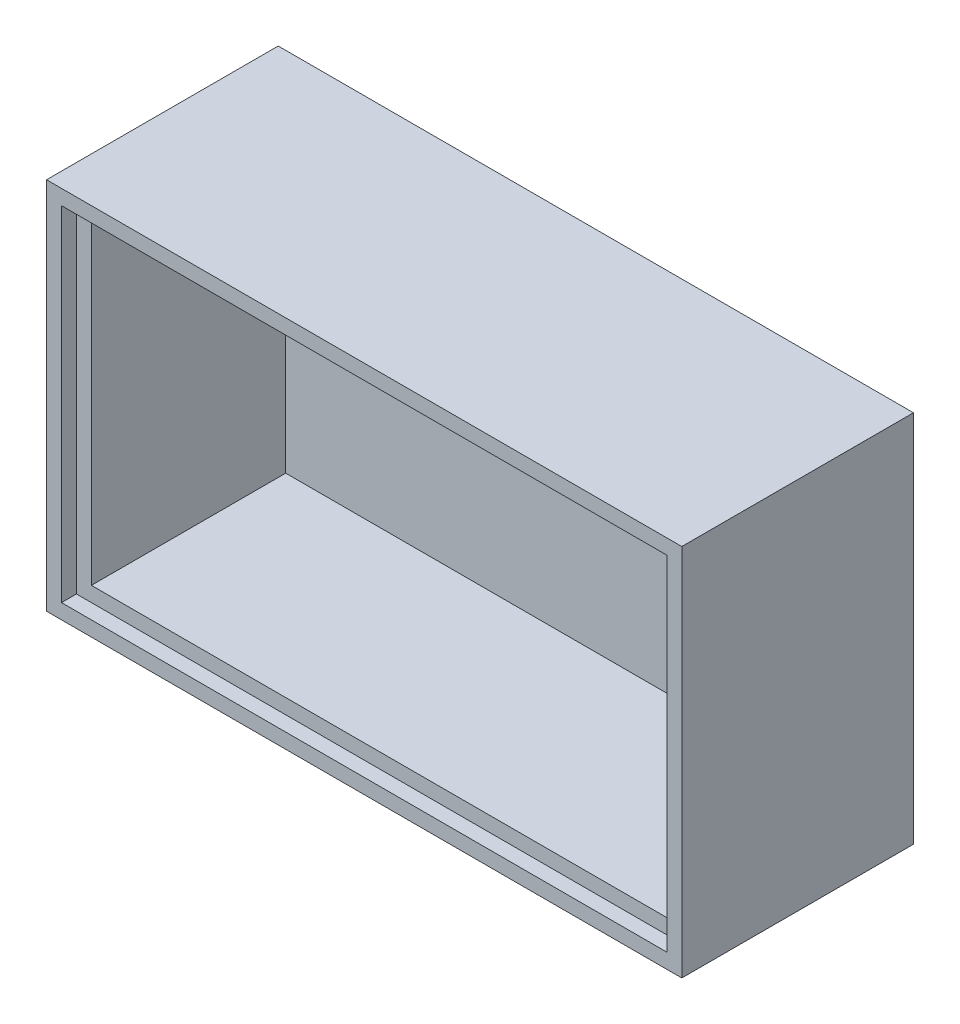
ISO-10303-21;
HEADER;
FILE_DESCRIPTION(('STEP AP214'),'2;1');
FILE_NAME('part.step','',(''),(''),'','','');
FILE_SCHEMA(('AUTOMOTIVE_DESIGN { 1 0 10303 214 1 1 1 1 }'));
ENDSEC;
DATA;
#1=APPLICATION_CONTEXT('core data for automotive mechanical design processes');
#2=APPLICATION_PROTOCOL_DEFINITION('international standard','automotive_design',2000,#1);
#3=PRODUCT_CONTEXT('',#1,'mechanical');
#4=PRODUCT('Part','Part','',(#3));
#5=PRODUCT_RELATED_PRODUCT_CATEGORY('part','',(#4));
#6=PRODUCT_DEFINITION_FORMATION('','',#4);
#7=PRODUCT_DEFINITION_CONTEXT('part definition',#1,'design');
#8=PRODUCT_DEFINITION('design','',#6,#7);
#9=PRODUCT_DEFINITION_SHAPE('','',#8);
#10=(LENGTH_UNIT() NAMED_UNIT(*) SI_UNIT(.MILLI.,.METRE.));
#11=(NAMED_UNIT(*) PLANE_ANGLE_UNIT() SI_UNIT($,.RADIAN.));
#12=(NAMED_UNIT(*) SI_UNIT($,.STERADIAN.) SOLID_ANGLE_UNIT());
#13=UNCERTAINTY_MEASURE_WITH_UNIT(LENGTH_MEASURE(1.E-05),#10,'distance_accuracy_value','');
#14=(GEOMETRIC_REPRESENTATION_CONTEXT(3) GLOBAL_UNCERTAINTY_ASSIGNED_CONTEXT((#13)) GLOBAL_UNIT_ASSIGNED_CONTEXT((#10,
#11,#12)) REPRESENTATION_CONTEXT('',''));
#15=CARTESIAN_POINT('',(0.,0.,0.));
#16=DIRECTION('',(0.,0.,1.));
#17=DIRECTION('',(1.,0.,0.));
#18=AXIS2_PLACEMENT_3D('',#15,#16,#17);
#19=CARTESIAN_POINT('',(0.,0.,3.));
#20=DIRECTION('',(-1.,0.,0.));
#21=DIRECTION('',(0.,0.,1.));
#22=AXIS2_PLACEMENT_3D('',#19,#20,#21);
#23=PLANE('',#22);
#24=DIRECTION('',(0.,1.,0.));
#25=VECTOR('',#24,1.);
#26=CARTESIAN_POINT('',(0.,0.,0.));
#27=LINE('',#26,#25);
#28=CARTESIAN_POINT('',(0.,0.,0.));
#29=VERTEX_POINT('',#28);
#30=CARTESIAN_POINT('',(0.,50.,0.));
#31=VERTEX_POINT('',#30);
#32=EDGE_CURVE('E222',#29,#31,#27,.T.);
#33=ORIENTED_EDGE('',*,*,#32,.F.);
#34=DIRECTION('',(0.,0.,-1.));
#35=VECTOR('',#34,1.);
#36=CARTESIAN_POINT('',(0.,0.,3.));
#37=LINE('',#36,#35);
#38=CARTESIAN_POINT('',(0.,0.,31.));
#39=VERTEX_POINT('',#38);
#40=EDGE_CURVE('E238',#39,#29,#37,.T.);
#41=ORIENTED_EDGE('',*,*,#40,.F.);
#42=DIRECTION('',(0.,1.,0.));
#43=VECTOR('',#42,1.);
#44=CARTESIAN_POINT('',(0.,0.,31.));
#45=LINE('',#44,#43);
#46=CARTESIAN_POINT('',(0.,50.,31.));
#47=VERTEX_POINT('',#46);
#48=EDGE_CURVE('E199',#39,#47,#45,.T.);
#49=ORIENTED_EDGE('',*,*,#48,.T.);
#50=DIRECTION('',(0.,0.,-1.));
#51=VECTOR('',#50,1.);
#52=CARTESIAN_POINT('',(0.,50.,3.));
#53=LINE('',#52,#51);
#54=EDGE_CURVE('E237',#47,#31,#53,.T.);
#55=ORIENTED_EDGE('',*,*,#54,.T.);
#56=EDGE_LOOP('',(#33,#41,#49,#55));
#57=FACE_BOUND('',#56,.T.);
#58=ADVANCED_FACE('F39',(#57),#23,.T.);
#59=CARTESIAN_POINT('',(0.,0.,3.));
#60=DIRECTION('',(0.,1.,0.));
#61=DIRECTION('',(0.,0.,1.));
#62=AXIS2_PLACEMENT_3D('',#59,#60,#61);
#63=PLANE('',#62);
#64=DIRECTION('',(1.,0.,0.));
#65=VECTOR('',#64,1.);
#66=CARTESIAN_POINT('',(0.,0.,0.));
#67=LINE('',#66,#65);
#68=CARTESIAN_POINT('',(85.,0.,0.));
#69=VERTEX_POINT('',#68);
#70=EDGE_CURVE('E234',#29,#69,#67,.T.);
#71=ORIENTED_EDGE('',*,*,#70,.T.);
#72=DIRECTION('',(0.,0.,-1.));
#73=VECTOR('',#72,1.);
#74=CARTESIAN_POINT('',(85.,0.,3.));
#75=LINE('',#74,#73);
#76=CARTESIAN_POINT('',(85.,0.,31.));
#77=VERTEX_POINT('',#76);
#78=EDGE_CURVE('E242',#77,#69,#75,.T.);
#79=ORIENTED_EDGE('',*,*,#78,.F.);
#80=DIRECTION('',(1.,0.,0.));
#81=VECTOR('',#80,1.);
#82=CARTESIAN_POINT('',(0.,0.,31.));
#83=LINE('',#82,#81);
#84=EDGE_CURVE('E187',#39,#77,#83,.T.);
#85=ORIENTED_EDGE('',*,*,#84,.F.);
#86=ORIENTED_EDGE('',*,*,#40,.T.);
#87=EDGE_LOOP('',(#71,#79,#85,#86));
#88=FACE_BOUND('',#87,.T.);
#89=ADVANCED_FACE('F285',(#88),#63,.F.);
#90=CARTESIAN_POINT('',(85.,0.,3.));
#91=DIRECTION('',(-1.,0.,0.));
#92=DIRECTION('',(0.,0.,1.));
#93=AXIS2_PLACEMENT_3D('',#90,#91,#92);
#94=PLANE('',#93);
#95=DIRECTION('',(0.,1.,0.));
#96=VECTOR('',#95,1.);
#97=CARTESIAN_POINT('',(85.,0.,0.));
#98=LINE('',#97,#96);
#99=CARTESIAN_POINT('',(85.,50.,0.));
#100=VERTEX_POINT('',#99);
#101=EDGE_CURVE('E230',#69,#100,#98,.T.);
#102=ORIENTED_EDGE('',*,*,#101,.T.);
#103=DIRECTION('',(0.,0.,-1.));
#104=VECTOR('',#103,1.);
#105=CARTESIAN_POINT('',(85.,50.,3.));
#106=LINE('',#105,#104);
#107=CARTESIAN_POINT('',(85.,50.,31.));
#108=VERTEX_POINT('',#107);
#109=EDGE_CURVE('E246',#108,#100,#106,.T.);
#110=ORIENTED_EDGE('',*,*,#109,.F.);
#111=DIRECTION('',(0.,1.,0.));
#112=VECTOR('',#111,1.);
#113=CARTESIAN_POINT('',(85.,0.,31.));
#114=LINE('',#113,#112);
#115=EDGE_CURVE('E191',#77,#108,#114,.T.);
#116=ORIENTED_EDGE('',*,*,#115,.F.);
#117=ORIENTED_EDGE('',*,*,#78,.T.);
#118=EDGE_LOOP('',(#102,#110,#116,#117));
#119=FACE_BOUND('',#118,.T.);
#120=ADVANCED_FACE('F290',(#119),#94,.F.);
#121=CARTESIAN_POINT('',(0.,50.,3.));
#122=DIRECTION('',(0.,1.,0.));
#123=DIRECTION('',(0.,0.,1.));
#124=AXIS2_PLACEMENT_3D('',#121,#122,#123);
#125=PLANE('',#124);
#126=DIRECTION('',(1.,0.,0.));
#127=VECTOR('',#126,1.);
#128=CARTESIAN_POINT('',(0.,50.,0.));
#129=LINE('',#128,#127);
#130=EDGE_CURVE('E226',#31,#100,#129,.T.);
#131=ORIENTED_EDGE('',*,*,#130,.F.);
#132=ORIENTED_EDGE('',*,*,#54,.F.);
#133=DIRECTION('',(1.,0.,0.));
#134=VECTOR('',#133,1.);
#135=CARTESIAN_POINT('',(0.,50.,31.));
#136=LINE('',#135,#134);
#137=EDGE_CURVE('E195',#47,#108,#136,.T.);
#138=ORIENTED_EDGE('',*,*,#137,.T.);
#139=ORIENTED_EDGE('',*,*,#109,.T.);
#140=EDGE_LOOP('',(#131,#132,#138,#139));
#141=FACE_BOUND('',#140,.T.);
#142=ADVANCED_FACE('F308',(#141),#125,.T.);
#143=CARTESIAN_POINT('',(0.,0.,0.));
#144=DIRECTION('',(0.,0.,-1.));
#145=DIRECTION('',(-1.,0.,0.));
#146=AXIS2_PLACEMENT_3D('',#143,#144,#145);
#147=PLANE('',#146);
#148=ORIENTED_EDGE('',*,*,#32,.T.);
#149=ORIENTED_EDGE('',*,*,#130,.T.);
#150=ORIENTED_EDGE('',*,*,#101,.F.);
#151=ORIENTED_EDGE('',*,*,#70,.F.);
#152=EDGE_LOOP('',(#148,#149,#150,#151));
#153=FACE_BOUND('',#152,.T.);
#154=ADVANCED_FACE('F298',(#153),#147,.T.);
#155=CARTESIAN_POINT('',(0.,48.,31.));
#156=DIRECTION('',(0.,1.,0.));
#157=DIRECTION('',(0.,0.,1.));
#158=AXIS2_PLACEMENT_3D('',#155,#156,#157);
#159=PLANE('',#158);
#160=DIRECTION('',(0.,0.,-1.));
#161=VECTOR('',#160,1.);
#162=CARTESIAN_POINT('',(2.,48.,31.));
#163=LINE('',#162,#161);
#164=CARTESIAN_POINT('',(2.,48.,31.));
#165=VERTEX_POINT('',#164);
#166=CARTESIAN_POINT('',(2.,48.,29.));
#167=VERTEX_POINT('',#166);
#168=EDGE_CURVE('E141',#165,#167,#163,.T.);
#169=ORIENTED_EDGE('',*,*,#168,.T.);
#170=DIRECTION('',(1.,0.,0.));
#171=VECTOR('',#170,1.);
#172=CARTESIAN_POINT('',(0.,48.,29.));
#173=LINE('',#172,#171);
#174=CARTESIAN_POINT('',(83.,48.,29.));
#175=VERTEX_POINT('',#174);
#176=EDGE_CURVE('E54',#167,#175,#173,.T.);
#177=ORIENTED_EDGE('',*,*,#176,.T.);
#178=DIRECTION('',(0.,0.,-1.));
#179=VECTOR('',#178,1.);
#180=CARTESIAN_POINT('',(83.,48.,31.));
#181=LINE('',#180,#179);
#182=CARTESIAN_POINT('',(83.,48.,31.));
#183=VERTEX_POINT('',#182);
#184=EDGE_CURVE('E219',#183,#175,#181,.T.);
#185=ORIENTED_EDGE('',*,*,#184,.F.);
#186=DIRECTION('',(1.,0.,0.));
#187=VECTOR('',#186,1.);
#188=CARTESIAN_POINT('',(0.,48.,31.));
#189=LINE('',#188,#187);
#190=EDGE_CURVE('E203',#165,#183,#189,.T.);
#191=ORIENTED_EDGE('',*,*,#190,.F.);
#192=EDGE_LOOP('',(#169,#177,#185,#191));
#193=FACE_BOUND('',#192,.T.);
#194=ADVANCED_FACE('F314',(#193),#159,.F.);
#195=CARTESIAN_POINT('',(83.,0.,31.));
#196=DIRECTION('',(1.,0.,0.));
#197=DIRECTION('',(0.,0.,-1.));
#198=AXIS2_PLACEMENT_3D('',#195,#196,#197);
#199=PLANE('',#198);
#200=ORIENTED_EDGE('',*,*,#184,.T.);
#201=DIRECTION('',(0.,-1.,0.));
#202=VECTOR('',#201,1.);
#203=CARTESIAN_POINT('',(83.,0.,29.));
#204=LINE('',#203,#202);
#205=CARTESIAN_POINT('',(83.,2.,29.));
#206=VERTEX_POINT('',#205);
#207=EDGE_CURVE('E61',#175,#206,#204,.T.);
#208=ORIENTED_EDGE('',*,*,#207,.T.);
#209=DIRECTION('',(0.,0.,-1.));
#210=VECTOR('',#209,1.);
#211=CARTESIAN_POINT('',(83.,2.,31.));
#212=LINE('',#211,#210);
#213=CARTESIAN_POINT('',(83.,2.,31.));
#214=VERTEX_POINT('',#213);
#215=EDGE_CURVE('E140',#214,#206,#212,.T.);
#216=ORIENTED_EDGE('',*,*,#215,.F.);
#217=DIRECTION('',(0.,-1.,0.));
#218=VECTOR('',#217,1.);
#219=CARTESIAN_POINT('',(83.,0.,31.));
#220=LINE('',#219,#218);
#221=EDGE_CURVE('E207',#183,#214,#220,.T.);
#222=ORIENTED_EDGE('',*,*,#221,.F.);
#223=EDGE_LOOP('',(#200,#208,#216,#222));
#224=FACE_BOUND('',#223,.T.);
#225=ADVANCED_FACE('F320',(#224),#199,.F.);
#226=CARTESIAN_POINT('',(0.,2.,31.));
#227=DIRECTION('',(0.,1.,0.));
#228=DIRECTION('',(0.,0.,1.));
#229=AXIS2_PLACEMENT_3D('',#226,#227,#228);
#230=PLANE('',#229);
#231=DIRECTION('',(1.,0.,0.));
#232=VECTOR('',#231,1.);
#233=CARTESIAN_POINT('',(0.,2.,29.));
#234=LINE('',#233,#232);
#235=CARTESIAN_POINT('',(2.00000000000001,2.,29.));
#236=VERTEX_POINT('',#235);
#237=EDGE_CURVE('E144',#236,#206,#234,.T.);
#238=ORIENTED_EDGE('',*,*,#237,.F.);
#239=DIRECTION('',(0.,0.,-1.));
#240=VECTOR('',#239,1.);
#241=CARTESIAN_POINT('',(2.00000000000001,2.,31.));
#242=LINE('',#241,#240);
#243=CARTESIAN_POINT('',(2.00000000000001,2.,31.));
#244=VERTEX_POINT('',#243);
#245=EDGE_CURVE('E129',#244,#236,#242,.T.);
#246=ORIENTED_EDGE('',*,*,#245,.F.);
#247=DIRECTION('',(1.,0.,0.));
#248=VECTOR('',#247,1.);
#249=CARTESIAN_POINT('',(0.,2.,31.));
#250=LINE('',#249,#248);
#251=EDGE_CURVE('E210',#244,#214,#250,.T.);
#252=ORIENTED_EDGE('',*,*,#251,.T.);
#253=ORIENTED_EDGE('',*,*,#215,.T.);
#254=EDGE_LOOP('',(#238,#246,#252,#253));
#255=FACE_BOUND('',#254,.T.);
#256=ADVANCED_FACE('F145',(#255),#230,.T.);
#257=CARTESIAN_POINT('',(2.00000000000001,0.,31.));
#258=DIRECTION('',(1.,0.,0.));
#259=DIRECTION('',(0.,1.,0.));
#260=AXIS2_PLACEMENT_3D('',#257,#258,#259);
#261=PLANE('',#260);
#262=DIRECTION('',(0.,-1.,0.));
#263=VECTOR('',#262,1.);
#264=CARTESIAN_POINT('',(2.00000000000001,0.,29.));
#265=LINE('',#264,#263);
#266=EDGE_CURVE('E133',#167,#236,#265,.T.);
#267=ORIENTED_EDGE('',*,*,#266,.F.);
#268=ORIENTED_EDGE('',*,*,#168,.F.);
#269=DIRECTION('',(0.,-1.,0.));
#270=VECTOR('',#269,1.);
#271=CARTESIAN_POINT('',(2.00000000000001,0.,31.));
#272=LINE('',#271,#270);
#273=EDGE_CURVE('E135',#165,#244,#272,.T.);
#274=ORIENTED_EDGE('',*,*,#273,.T.);
#275=ORIENTED_EDGE('',*,*,#245,.T.);
#276=EDGE_LOOP('',(#267,#268,#274,#275));
#277=FACE_BOUND('',#276,.T.);
#278=ADVANCED_FACE('F131',(#277),#261,.T.);
#279=CARTESIAN_POINT('',(0.,0.,31.));
#280=DIRECTION('',(0.,0.,1.));
#281=DIRECTION('',(1.,0.,0.));
#282=AXIS2_PLACEMENT_3D('',#279,#280,#281);
#283=PLANE('',#282);
#284=ORIENTED_EDGE('',*,*,#84,.T.);
#285=ORIENTED_EDGE('',*,*,#115,.T.);
#286=ORIENTED_EDGE('',*,*,#137,.F.);
#287=ORIENTED_EDGE('',*,*,#48,.F.);
#288=EDGE_LOOP('',(#284,#285,#286,#287));
#289=FACE_BOUND('',#288,.T.);
#290=ORIENTED_EDGE('',*,*,#190,.T.);
#291=ORIENTED_EDGE('',*,*,#221,.T.);
#292=ORIENTED_EDGE('',*,*,#251,.F.);
#293=ORIENTED_EDGE('',*,*,#273,.F.);
#294=EDGE_LOOP('',(#290,#291,#292,#293));
#295=FACE_BOUND('',#294,.T.);
#296=ADVANCED_FACE('F305',(#289,#295),#283,.T.);
#297=CARTESIAN_POINT('',(0.,46.,29.));
#298=DIRECTION('',(0.,1.,0.));
#299=DIRECTION('',(0.,0.,1.));
#300=AXIS2_PLACEMENT_3D('',#297,#298,#299);
#301=PLANE('',#300);
#302=DIRECTION('',(0.,0.,-1.));
#303=VECTOR('',#302,1.);
#304=CARTESIAN_POINT('',(4.,46.,29.));
#305=LINE('',#304,#303);
#306=CARTESIAN_POINT('',(4.,46.,29.));
#307=VERTEX_POINT('',#306);
#308=CARTESIAN_POINT('',(4.,46.,3.00000000000001));
#309=VERTEX_POINT('',#308);
#310=EDGE_CURVE('E172',#307,#309,#305,.T.);
#311=ORIENTED_EDGE('',*,*,#310,.T.);
#312=DIRECTION('',(1.,0.,0.));
#313=VECTOR('',#312,1.);
#314=CARTESIAN_POINT('',(0.,46.,3.));
#315=LINE('',#314,#313);
#316=CARTESIAN_POINT('',(81.,46.,3.00000000000001));
#317=VERTEX_POINT('',#316);
#318=EDGE_CURVE('E11',#309,#317,#315,.T.);
#319=ORIENTED_EDGE('',*,*,#318,.T.);
#320=DIRECTION('',(0.,0.,-1.));
#321=VECTOR('',#320,1.);
#322=CARTESIAN_POINT('',(81.,46.,29.));
#323=LINE('',#322,#321);
#324=CARTESIAN_POINT('',(81.,46.,29.));
#325=VERTEX_POINT('',#324);
#326=EDGE_CURVE('E183',#325,#317,#323,.T.);
#327=ORIENTED_EDGE('',*,*,#326,.F.);
#328=DIRECTION('',(1.,0.,0.));
#329=VECTOR('',#328,1.);
#330=CARTESIAN_POINT('',(0.,46.,29.));
#331=LINE('',#330,#329);
#332=EDGE_CURVE('E148',#307,#325,#331,.T.);
#333=ORIENTED_EDGE('',*,*,#332,.F.);
#334=EDGE_LOOP('',(#311,#319,#327,#333));
#335=FACE_BOUND('',#334,.T.);
#336=ADVANCED_FACE('F274',(#335),#301,.F.);
#337=CARTESIAN_POINT('',(81.,0.,29.));
#338=DIRECTION('',(1.,0.,0.));
#339=DIRECTION('',(0.,0.,-1.));
#340=AXIS2_PLACEMENT_3D('',#337,#338,#339);
#341=PLANE('',#340);
#342=ORIENTED_EDGE('',*,*,#326,.T.);
#343=DIRECTION('',(0.,-1.,0.));
#344=VECTOR('',#343,1.);
#345=CARTESIAN_POINT('',(81.,0.,3.));
#346=LINE('',#345,#344);
#347=CARTESIAN_POINT('',(81.,4.,3.00000000000001));
#348=VERTEX_POINT('',#347);
#349=EDGE_CURVE('E47',#317,#348,#346,.T.);
#350=ORIENTED_EDGE('',*,*,#349,.T.);
#351=DIRECTION('',(0.,0.,-1.));
#352=VECTOR('',#351,1.);
#353=CARTESIAN_POINT('',(81.,4.,29.));
#354=LINE('',#353,#352);
#355=CARTESIAN_POINT('',(81.,4.,29.));
#356=VERTEX_POINT('',#355);
#357=EDGE_CURVE('E179',#356,#348,#354,.T.);
#358=ORIENTED_EDGE('',*,*,#357,.F.);
#359=DIRECTION('',(0.,-1.,0.));
#360=VECTOR('',#359,1.);
#361=CARTESIAN_POINT('',(81.,0.,29.));
#362=LINE('',#361,#360);
#363=EDGE_CURVE('E161',#325,#356,#362,.T.);
#364=ORIENTED_EDGE('',*,*,#363,.F.);
#365=EDGE_LOOP('',(#342,#350,#358,#364));
#366=FACE_BOUND('',#365,.T.);
#367=ADVANCED_FACE('F261',(#366),#341,.F.);
#368=CARTESIAN_POINT('',(0.,4.,29.));
#369=DIRECTION('',(0.,1.,0.));
#370=DIRECTION('',(0.,0.,1.));
#371=AXIS2_PLACEMENT_3D('',#368,#369,#370);
#372=PLANE('',#371);
#373=DIRECTION('',(1.,0.,0.));
#374=VECTOR('',#373,1.);
#375=CARTESIAN_POINT('',(0.,4.,3.));
#376=LINE('',#375,#374);
#377=CARTESIAN_POINT('',(4.00000000000001,4.,3.));
#378=VERTEX_POINT('',#377);
#379=EDGE_CURVE('E254',#378,#348,#376,.T.);
#380=ORIENTED_EDGE('',*,*,#379,.F.);
#381=DIRECTION('',(0.,0.,-1.));
#382=VECTOR('',#381,1.);
#383=CARTESIAN_POINT('',(4.00000000000001,4.,29.));
#384=LINE('',#383,#382);
#385=CARTESIAN_POINT('',(4.00000000000001,4.,29.));
#386=VERTEX_POINT('',#385);
#387=EDGE_CURVE('E176',#386,#378,#384,.T.);
#388=ORIENTED_EDGE('',*,*,#387,.F.);
#389=DIRECTION('',(1.,0.,0.));
#390=VECTOR('',#389,1.);
#391=CARTESIAN_POINT('',(0.,4.,29.));
#392=LINE('',#391,#390);
#393=EDGE_CURVE('E164',#386,#356,#392,.T.);
#394=ORIENTED_EDGE('',*,*,#393,.T.);
#395=ORIENTED_EDGE('',*,*,#357,.T.);
#396=EDGE_LOOP('',(#380,#388,#394,#395));
#397=FACE_BOUND('',#396,.T.);
#398=ADVANCED_FACE('F267',(#397),#372,.T.);
#399=CARTESIAN_POINT('',(4.00000000000001,0.,29.));
#400=DIRECTION('',(1.,0.,0.));
#401=DIRECTION('',(0.,1.,0.));
#402=AXIS2_PLACEMENT_3D('',#399,#400,#401);
#403=PLANE('',#402);
#404=DIRECTION('',(0.,-1.,0.));
#405=VECTOR('',#404,1.);
#406=CARTESIAN_POINT('',(4.00000000000001,0.,3.));
#407=LINE('',#406,#405);
#408=EDGE_CURVE('E241',#309,#378,#407,.T.);
#409=ORIENTED_EDGE('',*,*,#408,.F.);
#410=ORIENTED_EDGE('',*,*,#310,.F.);
#411=DIRECTION('',(0.,-1.,0.));
#412=VECTOR('',#411,1.);
#413=CARTESIAN_POINT('',(4.00000000000001,0.,29.));
#414=LINE('',#413,#412);
#415=EDGE_CURVE('E168',#307,#386,#414,.T.);
#416=ORIENTED_EDGE('',*,*,#415,.T.);
#417=ORIENTED_EDGE('',*,*,#387,.T.);
#418=EDGE_LOOP('',(#409,#410,#416,#417));
#419=FACE_BOUND('',#418,.T.);
#420=ADVANCED_FACE('F271',(#419),#403,.T.);
#421=CARTESIAN_POINT('',(0.,0.,29.));
#422=DIRECTION('',(0.,0.,1.));
#423=DIRECTION('',(1.,0.,0.));
#424=AXIS2_PLACEMENT_3D('',#421,#422,#423);
#425=PLANE('',#424);
#426=ORIENTED_EDGE('',*,*,#207,.F.);
#427=ORIENTED_EDGE('',*,*,#176,.F.);
#428=ORIENTED_EDGE('',*,*,#266,.T.);
#429=ORIENTED_EDGE('',*,*,#237,.T.);
#430=EDGE_LOOP('',(#426,#427,#428,#429));
#431=FACE_BOUND('',#430,.T.);
#432=ORIENTED_EDGE('',*,*,#332,.T.);
#433=ORIENTED_EDGE('',*,*,#363,.T.);
#434=ORIENTED_EDGE('',*,*,#393,.F.);
#435=ORIENTED_EDGE('',*,*,#415,.F.);
#436=EDGE_LOOP('',(#432,#433,#434,#435));
#437=FACE_BOUND('',#436,.T.);
#438=ADVANCED_FACE('F150',(#431,#437),#425,.T.);
#439=CARTESIAN_POINT('',(0.,0.,3.));
#440=DIRECTION('',(0.,0.,-1.));
#441=DIRECTION('',(-1.,0.,0.));
#442=AXIS2_PLACEMENT_3D('',#439,#440,#441);
#443=PLANE('',#442);
#444=ORIENTED_EDGE('',*,*,#318,.F.);
#445=ORIENTED_EDGE('',*,*,#408,.T.);
#446=ORIENTED_EDGE('',*,*,#379,.T.);
#447=ORIENTED_EDGE('',*,*,#349,.F.);
#448=EDGE_LOOP('',(#444,#445,#446,#447));
#449=FACE_BOUND('',#448,.T.);
#450=ADVANCED_FACE('F269',(#449),#443,.F.);
#451=CLOSED_SHELL('',(#58,#89,#120,#142,#154,#194,#225,#256,#278,#296,#336,#367,#398,#420,#438,#450));
#452=MANIFOLD_SOLID_BREP('B2',#451);
#453=ADVANCED_BREP_SHAPE_REPRESENTATION('',(#18,#452),#14);
#454=SHAPE_DEFINITION_REPRESENTATION(#9,#453);
ENDSEC;
END-ISO-10303-21;
